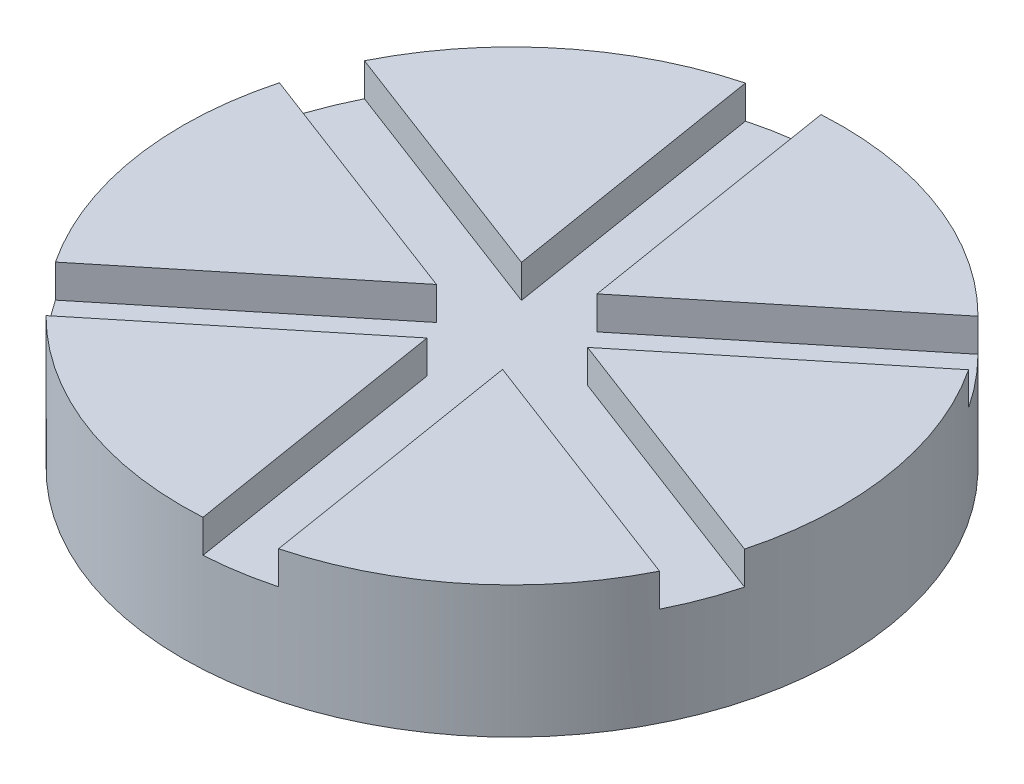
ISO-10303-21;
HEADER;
FILE_DESCRIPTION(('STEP AP214'),'2;1');
FILE_NAME('part.step','',(''),(''),'','','');
FILE_SCHEMA(('AUTOMOTIVE_DESIGN { 1 0 10303 214 1 1 1 1 }'));
ENDSEC;
DATA;
#1=APPLICATION_CONTEXT('core data for automotive mechanical design processes');
#2=APPLICATION_PROTOCOL_DEFINITION('international standard','automotive_design',2000,#1);
#3=PRODUCT_CONTEXT('',#1,'mechanical');
#4=PRODUCT('Part','Part','',(#3));
#5=PRODUCT_RELATED_PRODUCT_CATEGORY('part','',(#4));
#6=PRODUCT_DEFINITION_FORMATION('','',#4);
#7=PRODUCT_DEFINITION_CONTEXT('part definition',#1,'design');
#8=PRODUCT_DEFINITION('design','',#6,#7);
#9=PRODUCT_DEFINITION_SHAPE('','',#8);
#10=(LENGTH_UNIT() NAMED_UNIT(*) SI_UNIT(.MILLI.,.METRE.));
#11=(NAMED_UNIT(*) PLANE_ANGLE_UNIT() SI_UNIT($,.RADIAN.));
#12=(NAMED_UNIT(*) SI_UNIT($,.STERADIAN.) SOLID_ANGLE_UNIT());
#13=UNCERTAINTY_MEASURE_WITH_UNIT(LENGTH_MEASURE(1.E-05),#10,'distance_accuracy_value','');
#14=(GEOMETRIC_REPRESENTATION_CONTEXT(3) GLOBAL_UNCERTAINTY_ASSIGNED_CONTEXT((#13)) GLOBAL_UNIT_ASSIGNED_CONTEXT((#10,
#11,#12)) REPRESENTATION_CONTEXT('',''));
#15=CARTESIAN_POINT('',(0.,0.,0.));
#16=DIRECTION('',(0.,0.,1.));
#17=DIRECTION('',(1.,0.,0.));
#18=AXIS2_PLACEMENT_3D('',#15,#16,#17);
#19=CARTESIAN_POINT('',(0.,50.8,0.));
#20=DIRECTION('',(0.,1.,0.));
#21=DIRECTION('',(0.,0.,1.));
#22=AXIS2_PLACEMENT_3D('',#19,#20,#21);
#23=PLANE('',#22);
#24=DIRECTION('',(-0.774983994841706,0.,0.63198086026334));
#25=VECTOR('',#24,1.);
#26=CARTESIAN_POINT('',(-25.0735149326498,50.8,4.05941484972765));
#27=LINE('',#26,#25);
#28=CARTESIAN_POINT('',(-25.0735149326498,50.8,4.05941484972765));
#29=VERTEX_POINT('',#28);
#30=CARTESIAN_POINT('',(-105.955772956272,50.8,70.0169563551502));
#31=VERTEX_POINT('',#30);
#32=EDGE_CURVE('E210',#29,#31,#27,.T.);
#33=ORIENTED_EDGE('',*,*,#32,.F.);
#34=DIRECTION('',(0.934803477114449,0.,0.355165396927595));
#35=VECTOR('',#34,1.);
#36=CARTESIAN_POINT('',(-4.51060054098045,50.8,11.8720041593535));
#37=LINE('',#36,#35);
#38=CARTESIAN_POINT('',(-122.635550459323,50.8,-33.0079045614654));
#39=VERTEX_POINT('',#38);
#40=EDGE_CURVE('E282',#39,#29,#37,.T.);
#41=ORIENTED_EDGE('',*,*,#40,.F.);
#42=CARTESIAN_POINT('',(0.,50.8,0.));
#43=DIRECTION('',(0.,1.,0.));
#44=DIRECTION('',(0.,0.,1.));
#45=AXIS2_PLACEMENT_3D('',#42,#43,#44);
#46=CIRCLE('',#45,127.);
#47=EDGE_CURVE('E270',#39,#31,#46,.T.);
#48=ORIENTED_EDGE('',*,*,#47,.T.);
#49=EDGE_LOOP('',(#33,#41,#48));
#50=FACE_BOUND('',#49,.T.);
#51=ADVANCED_FACE('F37',(#50),#23,.T.);
#52=DIRECTION('',(-0.934803477114448,0.,-0.355165396927597));
#53=VECTOR('',#52,1.);
#54=CARTESIAN_POINT('',(-114.209441052554,50.8,-56.9780095691581));
#55=LINE('',#54,#53);
#56=CARTESIAN_POINT('',(-16.052313850689,50.8,-19.6845934689793));
#57=VERTEX_POINT('',#56);
#58=CARTESIAN_POINT('',(-113.614349377362,50.8,-56.7519128801724));
#59=VERTEX_POINT('',#58);
#60=EDGE_CURVE('E220',#57,#59,#55,.T.);
#61=ORIENTED_EDGE('',*,*,#60,.F.);
#62=DIRECTION('',(0.159819482272741,0.,0.987146257190936));
#63=VECTOR('',#62,1.);
#64=CARTESIAN_POINT('',(-12.5367574663251,50.8,2.02970742486385));
#65=LINE('',#64,#63);
#66=CARTESIAN_POINT('',(-32.7320913537403,50.8,-122.709454385595));
#67=VERTEX_POINT('',#66);
#68=EDGE_CURVE('E281',#67,#57,#65,.T.);
#69=ORIENTED_EDGE('',*,*,#68,.F.);
#70=EDGE_CURVE('E329',#67,#59,#46,.T.);
#71=ORIENTED_EDGE('',*,*,#70,.T.);
#72=EDGE_LOOP('',(#61,#69,#71));
#73=FACE_BOUND('',#72,.T.);
#74=ADVANCED_FACE('F341',(#73),#23,.T.);
#75=DIRECTION('',(-0.159819482272743,0.,-0.987146257190935));
#76=VECTOR('',#75,1.);
#77=CARTESIAN_POINT('',(-7.76031678231347,50.8,-127.397282088113));
#78=LINE('',#77,#76);
#79=CARTESIAN_POINT('',(9.02120108196092,50.8,-23.7440083187071));
#80=VERTEX_POINT('',#79);
#81=CARTESIAN_POINT('',(-7.65857642109056,50.8,-126.768869235323));
#82=VERTEX_POINT('',#81);
#83=EDGE_CURVE('E218',#80,#82,#78,.T.);
#84=ORIENTED_EDGE('',*,*,#83,.F.);
#85=DIRECTION('',(-0.774983994841706,0.,0.63198086026334));
#86=VECTOR('',#85,1.);
#87=CARTESIAN_POINT('',(-8.02615692534448,50.8,-9.84229673448975));
#88=LINE('',#87,#86);
#89=CARTESIAN_POINT('',(89.9034591055828,50.8,-89.7015498241297));
#90=VERTEX_POINT('',#89);
#91=EDGE_CURVE('E279',#90,#80,#88,.T.);
#92=ORIENTED_EDGE('',*,*,#91,.F.);
#93=EDGE_CURVE('E310',#90,#82,#46,.T.);
#94=ORIENTED_EDGE('',*,*,#93,.T.);
#95=EDGE_LOOP('',(#84,#92,#94));
#96=FACE_BOUND('',#95,.T.);
#97=ADVANCED_FACE('F317',(#96),#23,.T.);
#98=DIRECTION('',(0.774983994841705,0.,-0.63198086026334));
#99=VECTOR('',#98,1.);
#100=CARTESIAN_POINT('',(25.0735149326498,50.8,-4.05941484972774));
#101=LINE('',#100,#99);
#102=CARTESIAN_POINT('',(25.0735149326498,50.8,-4.05941484972774));
#103=VERTEX_POINT('',#102);
#104=CARTESIAN_POINT('',(105.955772956272,50.8,-70.0169563551503));
#105=VERTEX_POINT('',#104);
#106=EDGE_CURVE('E216',#103,#105,#101,.T.);
#107=ORIENTED_EDGE('',*,*,#106,.F.);
#108=DIRECTION('',(-0.934803477114449,0.,-0.355165396927596));
#109=VECTOR('',#108,1.);
#110=CARTESIAN_POINT('',(4.5106005409805,50.8,-11.8720041593536));
#111=LINE('',#110,#109);
#112=CARTESIAN_POINT('',(122.635550459323,50.8,33.0079045614653));
#113=VERTEX_POINT('',#112);
#114=EDGE_CURVE('E277',#113,#103,#111,.T.);
#115=ORIENTED_EDGE('',*,*,#114,.F.);
#116=EDGE_CURVE('E332',#113,#105,#46,.T.);
#117=ORIENTED_EDGE('',*,*,#116,.T.);
#118=EDGE_LOOP('',(#107,#115,#117));
#119=FACE_BOUND('',#118,.T.);
#120=ADVANCED_FACE('F348',(#119),#23,.T.);
#121=DIRECTION('',(0.934803477114448,0.,0.355165396927596));
#122=VECTOR('',#121,1.);
#123=CARTESIAN_POINT('',(16.052313850689,50.8,19.6845934689793));
#124=LINE('',#123,#122);
#125=CARTESIAN_POINT('',(16.052313850689,50.8,19.6845934689793));
#126=VERTEX_POINT('',#125);
#127=CARTESIAN_POINT('',(113.614349377362,50.8,56.7519128801723));
#128=VERTEX_POINT('',#127);
#129=EDGE_CURVE('E214',#126,#128,#124,.T.);
#130=ORIENTED_EDGE('',*,*,#129,.F.);
#131=DIRECTION('',(-0.159819482272741,0.,-0.987146257190936));
#132=VECTOR('',#131,1.);
#133=CARTESIAN_POINT('',(12.5367574663251,50.8,-2.02970742486385));
#134=LINE('',#133,#132);
#135=CARTESIAN_POINT('',(32.7320913537403,50.8,122.709454385595));
#136=VERTEX_POINT('',#135);
#137=EDGE_CURVE('E275',#136,#126,#134,.T.);
#138=ORIENTED_EDGE('',*,*,#137,.F.);
#139=EDGE_CURVE('E271',#136,#128,#46,.T.);
#140=ORIENTED_EDGE('',*,*,#139,.T.);
#141=EDGE_LOOP('',(#130,#138,#140));
#142=FACE_BOUND('',#141,.T.);
#143=ADVANCED_FACE('F354',(#142),#23,.T.);
#144=CARTESIAN_POINT('',(0.,50.8,0.));
#145=DIRECTION('',(0.,-1.,0.));
#146=DIRECTION('',(0.,0.,-1.));
#147=AXIS2_PLACEMENT_3D('',#144,#145,#146);
#148=CYLINDRICAL_SURFACE('',#147,127.);
#149=ORIENTED_EDGE('',*,*,#93,.F.);
#150=DIRECTION('',(0.,-1.,0.));
#151=VECTOR('',#150,1.);
#152=CARTESIAN_POINT('',(89.9034591055828,50.8,-89.7015498241296));
#153=LINE('',#152,#151);
#154=CARTESIAN_POINT('',(89.9034591055828,38.1,-89.7015498241296));
#155=VERTEX_POINT('',#154);
#156=EDGE_CURVE('E250',#90,#155,#153,.T.);
#157=ORIENTED_EDGE('',*,*,#156,.T.);
#158=CARTESIAN_POINT('',(0.,38.1,0.));
#159=DIRECTION('',(0.,-1.,0.));
#160=DIRECTION('',(0.,0.,-1.));
#161=AXIS2_PLACEMENT_3D('',#158,#159,#160);
#162=CIRCLE('',#161,127.);
#163=CARTESIAN_POINT('',(105.955772956272,38.1,-70.0169563551503));
#164=VERTEX_POINT('',#163);
#165=EDGE_CURVE('E11',#155,#164,#162,.T.);
#166=ORIENTED_EDGE('',*,*,#165,.T.);
#167=DIRECTION('',(0.,-1.,0.));
#168=VECTOR('',#167,1.);
#169=CARTESIAN_POINT('',(105.955772956272,50.8,-70.0169563551503));
#170=LINE('',#169,#168);
#171=EDGE_CURVE('E247',#164,#105,#170,.F.);
#172=ORIENTED_EDGE('',*,*,#171,.T.);
#173=ORIENTED_EDGE('',*,*,#116,.F.);
#174=DIRECTION('',(0.,-1.,0.));
#175=VECTOR('',#174,1.);
#176=CARTESIAN_POINT('',(122.635550459323,50.8,33.0079045614653));
#177=LINE('',#176,#175);
#178=CARTESIAN_POINT('',(122.635550459323,38.1,33.0079045614653));
#179=VERTEX_POINT('',#178);
#180=EDGE_CURVE('E244',#113,#179,#177,.T.);
#181=ORIENTED_EDGE('',*,*,#180,.T.);
#182=CARTESIAN_POINT('',(113.614349377362,38.1,56.7519128801723));
#183=VERTEX_POINT('',#182);
#184=EDGE_CURVE('E46',#179,#183,#162,.T.);
#185=ORIENTED_EDGE('',*,*,#184,.T.);
#186=DIRECTION('',(0.,-1.,0.));
#187=VECTOR('',#186,1.);
#188=CARTESIAN_POINT('',(113.614349377362,50.8,56.7519128801723));
#189=LINE('',#188,#187);
#190=EDGE_CURVE('E241',#183,#128,#189,.F.);
#191=ORIENTED_EDGE('',*,*,#190,.T.);
#192=ORIENTED_EDGE('',*,*,#139,.F.);
#193=DIRECTION('',(0.,-1.,0.));
#194=VECTOR('',#193,1.);
#195=CARTESIAN_POINT('',(32.7320913537403,50.8,122.709454385595));
#196=LINE('',#195,#194);
#197=CARTESIAN_POINT('',(32.7320913537403,38.1,122.709454385595));
#198=VERTEX_POINT('',#197);
#199=EDGE_CURVE('E238',#136,#198,#196,.T.);
#200=ORIENTED_EDGE('',*,*,#199,.T.);
#201=CARTESIAN_POINT('',(7.65857642109056,38.1,126.768869235323));
#202=VERTEX_POINT('',#201);
#203=EDGE_CURVE('E290',#198,#202,#162,.T.);
#204=ORIENTED_EDGE('',*,*,#203,.T.);
#205=DIRECTION('',(0.,-1.,0.));
#206=VECTOR('',#205,1.);
#207=CARTESIAN_POINT('',(7.65857642109056,50.8,126.768869235323));
#208=LINE('',#207,#206);
#209=CARTESIAN_POINT('',(7.65857642109056,50.8,126.768869235323));
#210=VERTEX_POINT('',#209);
#211=EDGE_CURVE('E185',#202,#210,#208,.F.);
#212=ORIENTED_EDGE('',*,*,#211,.T.);
#213=CARTESIAN_POINT('',(-89.9034591055828,50.8,89.7015498241296));
#214=VERTEX_POINT('',#213);
#215=EDGE_CURVE('E267',#214,#210,#46,.T.);
#216=ORIENTED_EDGE('',*,*,#215,.F.);
#217=DIRECTION('',(0.,-1.,0.));
#218=VECTOR('',#217,1.);
#219=CARTESIAN_POINT('',(-89.9034591055828,50.8,89.7015498241296));
#220=LINE('',#219,#218);
#221=CARTESIAN_POINT('',(-89.9034591055828,38.1,89.7015498241296));
#222=VERTEX_POINT('',#221);
#223=EDGE_CURVE('E53',#214,#222,#220,.T.);
#224=ORIENTED_EDGE('',*,*,#223,.T.);
#225=CARTESIAN_POINT('',(-105.955772956272,38.1,70.0169563551502));
#226=VERTEX_POINT('',#225);
#227=EDGE_CURVE('E171',#222,#226,#162,.T.);
#228=ORIENTED_EDGE('',*,*,#227,.T.);
#229=DIRECTION('',(0.,-1.,0.));
#230=VECTOR('',#229,1.);
#231=CARTESIAN_POINT('',(-105.955772956272,50.8,70.0169563551502));
#232=LINE('',#231,#230);
#233=EDGE_CURVE('E61',#226,#31,#232,.F.);
#234=ORIENTED_EDGE('',*,*,#233,.T.);
#235=ORIENTED_EDGE('',*,*,#47,.F.);
#236=DIRECTION('',(0.,-1.,0.));
#237=VECTOR('',#236,1.);
#238=CARTESIAN_POINT('',(-122.635550459323,50.8,-33.0079045614654));
#239=LINE('',#238,#237);
#240=CARTESIAN_POINT('',(-122.635550459323,38.1,-33.0079045614654));
#241=VERTEX_POINT('',#240);
#242=EDGE_CURVE('E262',#39,#241,#239,.T.);
#243=ORIENTED_EDGE('',*,*,#242,.T.);
#244=CARTESIAN_POINT('',(-113.614349377362,38.1,-56.7519128801724));
#245=VERTEX_POINT('',#244);
#246=EDGE_CURVE('E287',#241,#245,#162,.T.);
#247=ORIENTED_EDGE('',*,*,#246,.T.);
#248=DIRECTION('',(0.,-1.,0.));
#249=VECTOR('',#248,1.);
#250=CARTESIAN_POINT('',(-113.614349377362,50.8,-56.7519128801724));
#251=LINE('',#250,#249);
#252=EDGE_CURVE('E259',#245,#59,#251,.F.);
#253=ORIENTED_EDGE('',*,*,#252,.T.);
#254=ORIENTED_EDGE('',*,*,#70,.F.);
#255=DIRECTION('',(0.,-1.,0.));
#256=VECTOR('',#255,1.);
#257=CARTESIAN_POINT('',(-32.7320913537403,50.8,-122.709454385595));
#258=LINE('',#257,#256);
#259=CARTESIAN_POINT('',(-32.7320913537403,38.1,-122.709454385595));
#260=VERTEX_POINT('',#259);
#261=EDGE_CURVE('E256',#67,#260,#258,.T.);
#262=ORIENTED_EDGE('',*,*,#261,.T.);
#263=CARTESIAN_POINT('',(-7.65857642109056,38.1,-126.768869235323));
#264=VERTEX_POINT('',#263);
#265=EDGE_CURVE('E41',#260,#264,#162,.T.);
#266=ORIENTED_EDGE('',*,*,#265,.T.);
#267=DIRECTION('',(0.,-1.,0.));
#268=VECTOR('',#267,1.);
#269=CARTESIAN_POINT('',(-7.65857642109056,50.8,-126.768869235323));
#270=LINE('',#269,#268);
#271=EDGE_CURVE('E253',#264,#82,#270,.F.);
#272=ORIENTED_EDGE('',*,*,#271,.T.);
#273=EDGE_LOOP('',(#149,#157,#166,#172,#173,#181,#185,#191,#192,#200,#204,#212,#216,#224,#228,
#234,#235,#243,#247,#253,#254,#262,#266,#272));
#274=FACE_BOUND('',#273,.T.);
#275=CARTESIAN_POINT('',(0.,0.,0.));
#276=DIRECTION('',(0.,1.,0.));
#277=DIRECTION('',(0.,0.,1.));
#278=AXIS2_PLACEMENT_3D('',#275,#276,#277);
#279=CIRCLE('',#278,127.);
#280=CARTESIAN_POINT('',(0.,0.,127.));
#281=VERTEX_POINT('',#280);
#282=EDGE_CURVE('E266',#281,#281,#279,.T.);
#283=ORIENTED_EDGE('',*,*,#282,.T.);
#284=EDGE_LOOP('',(#283));
#285=FACE_BOUND('',#284,.T.);
#286=ADVANCED_FACE('F39',(#274,#285),#148,.T.);
#287=DIRECTION('',(0.159819482272741,0.,0.987146257190936));
#288=VECTOR('',#287,1.);
#289=CARTESIAN_POINT('',(-9.02120108196074,50.8,23.7440083187071));
#290=LINE('',#289,#288);
#291=CARTESIAN_POINT('',(-9.02120108196074,50.8,23.7440083187071));
#292=VERTEX_POINT('',#291);
#293=EDGE_CURVE('E212',#292,#210,#290,.T.);
#294=ORIENTED_EDGE('',*,*,#293,.F.);
#295=DIRECTION('',(0.774983994841707,0.,-0.631980860263338));
#296=VECTOR('',#295,1.);
#297=CARTESIAN_POINT('',(8.02615692534455,50.8,9.84229673448986));
#298=LINE('',#297,#296);
#299=EDGE_CURVE('E177',#214,#292,#298,.T.);
#300=ORIENTED_EDGE('',*,*,#299,.F.);
#301=ORIENTED_EDGE('',*,*,#215,.T.);
#302=EDGE_LOOP('',(#294,#300,#301));
#303=FACE_BOUND('',#302,.T.);
#304=ADVANCED_FACE('F349',(#303),#23,.T.);
#305=CARTESIAN_POINT('',(0.,0.,0.));
#306=DIRECTION('',(0.,1.,0.));
#307=DIRECTION('',(0.,0.,1.));
#308=AXIS2_PLACEMENT_3D('',#305,#306,#307);
#309=PLANE('',#308);
#310=ORIENTED_EDGE('',*,*,#282,.F.);
#311=EDGE_LOOP('',(#310));
#312=FACE_BOUND('',#311,.T.);
#313=ADVANCED_FACE('F352',(#312),#309,.F.);
#314=CARTESIAN_POINT('',(0.,38.1,0.));
#315=DIRECTION('',(0.,-1.,0.));
#316=DIRECTION('',(0.,0.,-1.));
#317=AXIS2_PLACEMENT_3D('',#314,#315,#316);
#318=PLANE('',#317);
#319=DIRECTION('',(-0.774983994841706,0.,0.63198086026334));
#320=VECTOR('',#319,1.);
#321=CARTESIAN_POINT('',(90.3968104195521,38.1,-90.1038659879339));
#322=LINE('',#321,#320);
#323=CARTESIAN_POINT('',(9.02120108196092,38.1,-23.7440083187071));
#324=VERTEX_POINT('',#323);
#325=EDGE_CURVE('E199',#155,#324,#322,.T.);
#326=ORIENTED_EDGE('',*,*,#325,.T.);
#327=DIRECTION('',(-0.159819482272743,0.,-0.987146257190935));
#328=VECTOR('',#327,1.);
#329=CARTESIAN_POINT('',(-7.76031678231347,38.1,-127.397282088113));
#330=LINE('',#329,#328);
#331=EDGE_CURVE('E201',#324,#264,#330,.T.);
#332=ORIENTED_EDGE('',*,*,#331,.T.);
#333=ORIENTED_EDGE('',*,*,#265,.F.);
#334=DIRECTION('',(0.159819482272741,0.,0.987146257190936));
#335=VECTOR('',#334,1.);
#336=CARTESIAN_POINT('',(-16.052313850689,38.1,-19.6845934689793));
#337=LINE('',#336,#335);
#338=CARTESIAN_POINT('',(-16.052313850689,38.1,-19.6845934689793));
#339=VERTEX_POINT('',#338);
#340=EDGE_CURVE('E204',#260,#339,#337,.T.);
#341=ORIENTED_EDGE('',*,*,#340,.T.);
#342=DIRECTION('',(-0.934803477114448,0.,-0.355165396927597));
#343=VECTOR('',#342,1.);
#344=CARTESIAN_POINT('',(-114.209441052554,38.1,-56.9780095691581));
#345=LINE('',#344,#343);
#346=EDGE_CURVE('E206',#339,#245,#345,.T.);
#347=ORIENTED_EDGE('',*,*,#346,.T.);
#348=ORIENTED_EDGE('',*,*,#246,.F.);
#349=DIRECTION('',(0.934803477114449,0.,0.355165396927595));
#350=VECTOR('',#349,1.);
#351=CARTESIAN_POINT('',(-123.230642134515,38.1,-33.2340012504511));
#352=LINE('',#351,#350);
#353=CARTESIAN_POINT('',(-25.0735149326498,38.1,4.05941484972765));
#354=VERTEX_POINT('',#353);
#355=EDGE_CURVE('E181',#241,#354,#352,.T.);
#356=ORIENTED_EDGE('',*,*,#355,.T.);
#357=DIRECTION('',(-0.774983994841706,0.,0.63198086026334));
#358=VECTOR('',#357,1.);
#359=CARTESIAN_POINT('',(-25.0735149326498,38.1,4.05941484972765));
#360=LINE('',#359,#358);
#361=EDGE_CURVE('E172',#354,#226,#360,.T.);
#362=ORIENTED_EDGE('',*,*,#361,.T.);
#363=ORIENTED_EDGE('',*,*,#227,.F.);
#364=DIRECTION('',(0.774983994841707,0.,-0.631980860263339));
#365=VECTOR('',#364,1.);
#366=CARTESIAN_POINT('',(-90.3968104195522,38.1,90.1038659879338));
#367=LINE('',#366,#365);
#368=CARTESIAN_POINT('',(-9.02120108196074,38.1,23.7440083187071));
#369=VERTEX_POINT('',#368);
#370=EDGE_CURVE('E164',#222,#369,#367,.T.);
#371=ORIENTED_EDGE('',*,*,#370,.T.);
#372=DIRECTION('',(0.159819482272741,0.,0.987146257190936));
#373=VECTOR('',#372,1.);
#374=CARTESIAN_POINT('',(-9.02120108196074,38.1,23.7440083187071));
#375=LINE('',#374,#373);
#376=EDGE_CURVE('E168',#369,#202,#375,.T.);
#377=ORIENTED_EDGE('',*,*,#376,.T.);
#378=ORIENTED_EDGE('',*,*,#203,.F.);
#379=DIRECTION('',(-0.159819482272741,0.,-0.987146257190936));
#380=VECTOR('',#379,1.);
#381=CARTESIAN_POINT('',(32.8338317149632,38.1,123.337867238385));
#382=LINE('',#381,#380);
#383=CARTESIAN_POINT('',(16.052313850689,38.1,19.6845934689793));
#384=VERTEX_POINT('',#383);
#385=EDGE_CURVE('E186',#198,#384,#382,.T.);
#386=ORIENTED_EDGE('',*,*,#385,.T.);
#387=DIRECTION('',(0.934803477114448,0.,0.355165396927596));
#388=VECTOR('',#387,1.);
#389=CARTESIAN_POINT('',(16.052313850689,38.1,19.6845934689793));
#390=LINE('',#389,#388);
#391=EDGE_CURVE('E188',#384,#183,#390,.T.);
#392=ORIENTED_EDGE('',*,*,#391,.T.);
#393=ORIENTED_EDGE('',*,*,#184,.F.);
#394=DIRECTION('',(-0.934803477114449,0.,-0.355165396927596));
#395=VECTOR('',#394,1.);
#396=CARTESIAN_POINT('',(123.230642134515,38.1,33.2340012504511));
#397=LINE('',#396,#395);
#398=CARTESIAN_POINT('',(25.0735149326498,38.1,-4.05941484972774));
#399=VERTEX_POINT('',#398);
#400=EDGE_CURVE('E194',#179,#399,#397,.T.);
#401=ORIENTED_EDGE('',*,*,#400,.T.);
#402=DIRECTION('',(0.774983994841705,0.,-0.63198086026334));
#403=VECTOR('',#402,1.);
#404=CARTESIAN_POINT('',(25.0735149326498,38.1,-4.05941484972774));
#405=LINE('',#404,#403);
#406=EDGE_CURVE('E196',#399,#164,#405,.T.);
#407=ORIENTED_EDGE('',*,*,#406,.T.);
#408=ORIENTED_EDGE('',*,*,#165,.F.);
#409=EDGE_LOOP('',(#326,#332,#333,#341,#347,#348,#356,#362,#363,#371,#377,#378,#386,#392,#393,
#401,#407,#408));
#410=FACE_BOUND('',#409,.T.);
#411=ADVANCED_FACE('F166',(#410),#318,.F.);
#412=CARTESIAN_POINT('',(-25.0735149326498,38.1,4.05941484972765));
#413=DIRECTION('',(-0.63198086026334,0.,-0.774983994841706));
#414=DIRECTION('',(-0.774983994841706,0.,0.63198086026334));
#415=AXIS2_PLACEMENT_3D('',#412,#413,#414);
#416=PLANE('',#415);
#417=ORIENTED_EDGE('',*,*,#361,.F.);
#418=DIRECTION('',(0.,1.,0.));
#419=VECTOR('',#418,1.);
#420=CARTESIAN_POINT('',(-25.0735149326498,38.1,4.05941484972765));
#421=LINE('',#420,#419);
#422=EDGE_CURVE('E222',#354,#29,#421,.T.);
#423=ORIENTED_EDGE('',*,*,#422,.T.);
#424=ORIENTED_EDGE('',*,*,#32,.T.);
#425=ORIENTED_EDGE('',*,*,#233,.F.);
#426=EDGE_LOOP('',(#417,#423,#424,#425));
#427=FACE_BOUND('',#426,.T.);
#428=ADVANCED_FACE('F355',(#427),#416,.F.);
#429=CARTESIAN_POINT('',(-123.230642134515,38.1,-33.2340012504511));
#430=DIRECTION('',(-0.355165396927595,0.,0.934803477114449));
#431=DIRECTION('',(0.934803477114449,0.,0.355165396927595));
#432=AXIS2_PLACEMENT_3D('',#429,#430,#431);
#433=PLANE('',#432);
#434=ORIENTED_EDGE('',*,*,#40,.T.);
#435=ORIENTED_EDGE('',*,*,#422,.F.);
#436=ORIENTED_EDGE('',*,*,#355,.F.);
#437=ORIENTED_EDGE('',*,*,#242,.F.);
#438=EDGE_LOOP('',(#434,#435,#436,#437));
#439=FACE_BOUND('',#438,.T.);
#440=ADVANCED_FACE('F338',(#439),#433,.F.);
#441=CARTESIAN_POINT('',(-114.209441052554,38.1,-56.9780095691581));
#442=DIRECTION('',(0.355165396927597,0.,-0.934803477114448));
#443=DIRECTION('',(-0.934803477114448,0.,-0.355165396927597));
#444=AXIS2_PLACEMENT_3D('',#441,#442,#443);
#445=PLANE('',#444);
#446=ORIENTED_EDGE('',*,*,#346,.F.);
#447=DIRECTION('',(0.,1.,0.));
#448=VECTOR('',#447,1.);
#449=CARTESIAN_POINT('',(-16.052313850689,38.1,-19.6845934689793));
#450=LINE('',#449,#448);
#451=EDGE_CURVE('E225',#339,#57,#450,.T.);
#452=ORIENTED_EDGE('',*,*,#451,.T.);
#453=ORIENTED_EDGE('',*,*,#60,.T.);
#454=ORIENTED_EDGE('',*,*,#252,.F.);
#455=EDGE_LOOP('',(#446,#452,#453,#454));
#456=FACE_BOUND('',#455,.T.);
#457=ADVANCED_FACE('F340',(#456),#445,.F.);
#458=CARTESIAN_POINT('',(-16.052313850689,38.1,-19.6845934689793));
#459=DIRECTION('',(-0.987146257190936,0.,0.159819482272741));
#460=DIRECTION('',(0.159819482272741,0.,0.987146257190936));
#461=AXIS2_PLACEMENT_3D('',#458,#459,#460);
#462=PLANE('',#461);
#463=ORIENTED_EDGE('',*,*,#68,.T.);
#464=ORIENTED_EDGE('',*,*,#451,.F.);
#465=ORIENTED_EDGE('',*,*,#340,.F.);
#466=ORIENTED_EDGE('',*,*,#261,.F.);
#467=EDGE_LOOP('',(#463,#464,#465,#466));
#468=FACE_BOUND('',#467,.T.);
#469=ADVANCED_FACE('F324',(#468),#462,.F.);
#470=CARTESIAN_POINT('',(-7.76031678231347,38.1,-127.397282088113));
#471=DIRECTION('',(0.987146257190935,0.,-0.159819482272743));
#472=DIRECTION('',(-0.159819482272743,0.,-0.987146257190935));
#473=AXIS2_PLACEMENT_3D('',#470,#471,#472);
#474=PLANE('',#473);
#475=ORIENTED_EDGE('',*,*,#331,.F.);
#476=DIRECTION('',(0.,1.,0.));
#477=VECTOR('',#476,1.);
#478=CARTESIAN_POINT('',(9.02120108196092,38.1,-23.7440083187071));
#479=LINE('',#478,#477);
#480=EDGE_CURVE('E228',#324,#80,#479,.T.);
#481=ORIENTED_EDGE('',*,*,#480,.T.);
#482=ORIENTED_EDGE('',*,*,#83,.T.);
#483=ORIENTED_EDGE('',*,*,#271,.F.);
#484=EDGE_LOOP('',(#475,#481,#482,#483));
#485=FACE_BOUND('',#484,.T.);
#486=ADVANCED_FACE('F320',(#485),#474,.F.);
#487=CARTESIAN_POINT('',(90.3968104195521,38.1,-90.1038659879339));
#488=DIRECTION('',(-0.63198086026334,0.,-0.774983994841706));
#489=DIRECTION('',(-0.774983994841706,0.,0.63198086026334));
#490=AXIS2_PLACEMENT_3D('',#487,#488,#489);
#491=PLANE('',#490);
#492=ORIENTED_EDGE('',*,*,#91,.T.);
#493=ORIENTED_EDGE('',*,*,#480,.F.);
#494=ORIENTED_EDGE('',*,*,#325,.F.);
#495=ORIENTED_EDGE('',*,*,#156,.F.);
#496=EDGE_LOOP('',(#492,#493,#494,#495));
#497=FACE_BOUND('',#496,.T.);
#498=ADVANCED_FACE('F313',(#497),#491,.F.);
#499=CARTESIAN_POINT('',(25.0735149326498,38.1,-4.05941484972774));
#500=DIRECTION('',(0.63198086026334,0.,0.774983994841705));
#501=DIRECTION('',(0.774983994841705,0.,-0.63198086026334));
#502=AXIS2_PLACEMENT_3D('',#499,#500,#501);
#503=PLANE('',#502);
#504=ORIENTED_EDGE('',*,*,#406,.F.);
#505=DIRECTION('',(0.,1.,0.));
#506=VECTOR('',#505,1.);
#507=CARTESIAN_POINT('',(25.0735149326498,38.1,-4.05941484972774));
#508=LINE('',#507,#506);
#509=EDGE_CURVE('E231',#399,#103,#508,.T.);
#510=ORIENTED_EDGE('',*,*,#509,.T.);
#511=ORIENTED_EDGE('',*,*,#106,.T.);
#512=ORIENTED_EDGE('',*,*,#171,.F.);
#513=EDGE_LOOP('',(#504,#510,#511,#512));
#514=FACE_BOUND('',#513,.T.);
#515=ADVANCED_FACE('F306',(#514),#503,.F.);
#516=CARTESIAN_POINT('',(123.230642134515,38.1,33.2340012504511));
#517=DIRECTION('',(0.355165396927596,0.,-0.934803477114449));
#518=DIRECTION('',(-0.934803477114449,0.,-0.355165396927596));
#519=AXIS2_PLACEMENT_3D('',#516,#517,#518);
#520=PLANE('',#519);
#521=ORIENTED_EDGE('',*,*,#114,.T.);
#522=ORIENTED_EDGE('',*,*,#509,.F.);
#523=ORIENTED_EDGE('',*,*,#400,.F.);
#524=ORIENTED_EDGE('',*,*,#180,.F.);
#525=EDGE_LOOP('',(#521,#522,#523,#524));
#526=FACE_BOUND('',#525,.T.);
#527=ADVANCED_FACE('F301',(#526),#520,.F.);
#528=CARTESIAN_POINT('',(16.052313850689,38.1,19.6845934689793));
#529=DIRECTION('',(-0.355165396927596,0.,0.934803477114448));
#530=DIRECTION('',(0.934803477114449,0.,0.355165396927596));
#531=AXIS2_PLACEMENT_3D('',#528,#529,#530);
#532=PLANE('',#531);
#533=ORIENTED_EDGE('',*,*,#391,.F.);
#534=DIRECTION('',(0.,1.,0.));
#535=VECTOR('',#534,1.);
#536=CARTESIAN_POINT('',(16.052313850689,38.1,19.6845934689793));
#537=LINE('',#536,#535);
#538=EDGE_CURVE('E180',#384,#126,#537,.T.);
#539=ORIENTED_EDGE('',*,*,#538,.T.);
#540=ORIENTED_EDGE('',*,*,#129,.T.);
#541=ORIENTED_EDGE('',*,*,#190,.F.);
#542=EDGE_LOOP('',(#533,#539,#540,#541));
#543=FACE_BOUND('',#542,.T.);
#544=ADVANCED_FACE('F376',(#543),#532,.F.);
#545=CARTESIAN_POINT('',(32.8338317149632,38.1,123.337867238385));
#546=DIRECTION('',(0.987146257190936,0.,-0.159819482272741));
#547=DIRECTION('',(-0.159819482272741,0.,-0.987146257190936));
#548=AXIS2_PLACEMENT_3D('',#545,#546,#547);
#549=PLANE('',#548);
#550=ORIENTED_EDGE('',*,*,#137,.T.);
#551=ORIENTED_EDGE('',*,*,#538,.F.);
#552=ORIENTED_EDGE('',*,*,#385,.F.);
#553=ORIENTED_EDGE('',*,*,#199,.F.);
#554=EDGE_LOOP('',(#550,#551,#552,#553));
#555=FACE_BOUND('',#554,.T.);
#556=ADVANCED_FACE('F380',(#555),#549,.F.);
#557=CARTESIAN_POINT('',(-9.02120108196074,38.1,23.7440083187071));
#558=DIRECTION('',(-0.987146257190936,0.,0.159819482272741));
#559=DIRECTION('',(0.159819482272741,0.,0.987146257190936));
#560=AXIS2_PLACEMENT_3D('',#557,#558,#559);
#561=PLANE('',#560);
#562=ORIENTED_EDGE('',*,*,#376,.F.);
#563=DIRECTION('',(0.,1.,0.));
#564=VECTOR('',#563,1.);
#565=CARTESIAN_POINT('',(-9.02120108196074,38.1,23.7440083187071));
#566=LINE('',#565,#564);
#567=EDGE_CURVE('E175',#369,#292,#566,.T.);
#568=ORIENTED_EDGE('',*,*,#567,.T.);
#569=ORIENTED_EDGE('',*,*,#293,.T.);
#570=ORIENTED_EDGE('',*,*,#211,.F.);
#571=EDGE_LOOP('',(#562,#568,#569,#570));
#572=FACE_BOUND('',#571,.T.);
#573=ADVANCED_FACE('F183',(#572),#561,.F.);
#574=CARTESIAN_POINT('',(-90.3968104195522,38.1,90.1038659879338));
#575=DIRECTION('',(0.631980860263338,0.,0.774983994841707));
#576=DIRECTION('',(0.774983994841707,0.,-0.631980860263338));
#577=AXIS2_PLACEMENT_3D('',#574,#575,#576);
#578=PLANE('',#577);
#579=ORIENTED_EDGE('',*,*,#299,.T.);
#580=ORIENTED_EDGE('',*,*,#567,.F.);
#581=ORIENTED_EDGE('',*,*,#370,.F.);
#582=ORIENTED_EDGE('',*,*,#223,.F.);
#583=EDGE_LOOP('',(#579,#580,#581,#582));
#584=FACE_BOUND('',#583,.T.);
#585=ADVANCED_FACE('F176',(#584),#578,.F.);
#586=CLOSED_SHELL('',(#51,#74,#97,#120,#143,#286,#304,#313,#411,#428,#440,#457,#469,#486,#498,
#515,#527,#544,#556,#573,#585));
#587=MANIFOLD_SOLID_BREP('B2',#586);
#588=ADVANCED_BREP_SHAPE_REPRESENTATION('',(#18,#587),#14);
#589=SHAPE_DEFINITION_REPRESENTATION(#9,#588);
ENDSEC;
END-ISO-10303-21;
